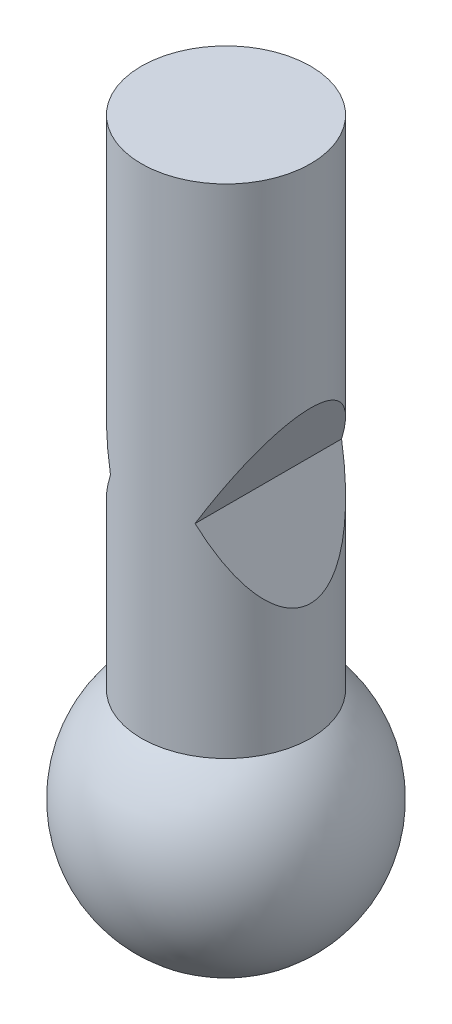
ISO-10303-21;
HEADER;
FILE_DESCRIPTION(('STEP AP214'),'2;1');
FILE_NAME('part.step','',(''),(''),'','','');
FILE_SCHEMA(('AUTOMOTIVE_DESIGN { 1 0 10303 214 1 1 1 1 }'));
ENDSEC;
DATA;
#1=APPLICATION_CONTEXT('core data for automotive mechanical design processes');
#2=APPLICATION_PROTOCOL_DEFINITION('international standard','automotive_design',2000,#1);
#3=PRODUCT_CONTEXT('',#1,'mechanical');
#4=PRODUCT('Part','Part','',(#3));
#5=PRODUCT_RELATED_PRODUCT_CATEGORY('part','',(#4));
#6=PRODUCT_DEFINITION_FORMATION('','',#4);
#7=PRODUCT_DEFINITION_CONTEXT('part definition',#1,'design');
#8=PRODUCT_DEFINITION('design','',#6,#7);
#9=PRODUCT_DEFINITION_SHAPE('','',#8);
#10=(LENGTH_UNIT() NAMED_UNIT(*) SI_UNIT(.MILLI.,.METRE.));
#11=(NAMED_UNIT(*) PLANE_ANGLE_UNIT() SI_UNIT($,.RADIAN.));
#12=(NAMED_UNIT(*) SI_UNIT($,.STERADIAN.) SOLID_ANGLE_UNIT());
#13=UNCERTAINTY_MEASURE_WITH_UNIT(LENGTH_MEASURE(1.E-05),#10,'distance_accuracy_value','');
#14=(GEOMETRIC_REPRESENTATION_CONTEXT(3) GLOBAL_UNCERTAINTY_ASSIGNED_CONTEXT((#13)) GLOBAL_UNIT_ASSIGNED_CONTEXT((#10,
#11,#12)) REPRESENTATION_CONTEXT('',''));
#15=CARTESIAN_POINT('',(0.,0.,0.));
#16=DIRECTION('',(0.,0.,1.));
#17=DIRECTION('',(1.,0.,0.));
#18=AXIS2_PLACEMENT_3D('',#15,#16,#17);
#19=CARTESIAN_POINT('',(0.,70.,0.));
#20=DIRECTION('',(0.,-1.,0.));
#21=DIRECTION('',(0.,0.,-1.));
#22=AXIS2_PLACEMENT_3D('',#19,#20,#21);
#23=CYLINDRICAL_SURFACE('',#22,10.);
#24=CARTESIAN_POINT('',(0.,44.9999999999996,0.));
#25=DIRECTION('',(-0.894427190999912,-0.447213595499966,0.));
#26=DIRECTION('',(0.447213595499966,-0.894427190999912,0.));
#27=AXIS2_PLACEMENT_3D('',#24,#25,#26);
#28=ELLIPSE('',#27,22.3606797749975,10.);
#29=CARTESIAN_POINT('',(4.99999999999989,35.,-8.66025403784445));
#30=VERTEX_POINT('',#29);
#31=CARTESIAN_POINT('',(4.99999999999989,35.,8.66025403784445));
#32=VERTEX_POINT('',#31);
#33=EDGE_CURVE('E11',#30,#32,#28,.T.);
#34=ORIENTED_EDGE('',*,*,#33,.T.);
#35=CARTESIAN_POINT('',(0.,25.0000000000004,0.));
#36=DIRECTION('',(-0.894427190999912,0.447213595499966,0.));
#37=DIRECTION('',(-0.447213595499966,-0.894427190999912,0.));
#38=AXIS2_PLACEMENT_3D('',#35,#36,#37);
#39=ELLIPSE('',#38,22.3606797749975,10.);
#40=EDGE_CURVE('E54',#32,#30,#39,.T.);
#41=ORIENTED_EDGE('',*,*,#40,.T.);
#42=EDGE_LOOP('',(#34,#41));
#43=FACE_BOUND('',#42,.T.);
#44=CARTESIAN_POINT('',(0.,45.0000000000002,0.));
#45=DIRECTION('',(0.894427190999914,-0.447213595499961,0.));
#46=DIRECTION('',(-0.447213595499961,-0.894427190999914,0.));
#47=AXIS2_PLACEMENT_3D('',#44,#45,#46);
#48=ELLIPSE('',#47,22.3606797749977,10.);
#49=CARTESIAN_POINT('',(-5.00000000000013,35.,8.66025403784431));
#50=VERTEX_POINT('',#49);
#51=CARTESIAN_POINT('',(-5.00000000000013,35.,-8.66025403784431));
#52=VERTEX_POINT('',#51);
#53=EDGE_CURVE('E80',#50,#52,#48,.T.);
#54=ORIENTED_EDGE('',*,*,#53,.T.);
#55=CARTESIAN_POINT('',(0.,25.0000000000001,0.));
#56=DIRECTION('',(0.894427190999909,0.447213595499971,0.));
#57=DIRECTION('',(0.447213595499971,-0.894427190999909,0.));
#58=AXIS2_PLACEMENT_3D('',#55,#56,#57);
#59=ELLIPSE('',#58,22.3606797749972,10.);
#60=EDGE_CURVE('E73',#52,#50,#59,.T.);
#61=ORIENTED_EDGE('',*,*,#60,.T.);
#62=EDGE_LOOP('',(#54,#61));
#63=FACE_BOUND('',#62,.T.);
#64=CARTESIAN_POINT('',(0.,11.1803398874989,0.));
#65=DIRECTION('',(0.,-1.,0.));
#66=DIRECTION('',(0.,0.,-1.));
#67=AXIS2_PLACEMENT_3D('',#64,#65,#66);
#68=CIRCLE('',#67,10.);
#69=CARTESIAN_POINT('',(0.,11.1803398874989,-10.));
#70=VERTEX_POINT('',#69);
#71=EDGE_CURVE('E85',#70,#70,#68,.T.);
#72=ORIENTED_EDGE('',*,*,#71,.F.);
#73=EDGE_LOOP('',(#72));
#74=FACE_BOUND('',#73,.T.);
#75=CARTESIAN_POINT('',(0.,70.,0.));
#76=DIRECTION('',(0.,1.,0.));
#77=DIRECTION('',(0.,0.,1.));
#78=AXIS2_PLACEMENT_3D('',#75,#76,#77);
#79=CIRCLE('',#78,10.);
#80=CARTESIAN_POINT('',(0.,70.,10.));
#81=VERTEX_POINT('',#80);
#82=EDGE_CURVE('E91',#81,#81,#79,.T.);
#83=ORIENTED_EDGE('',*,*,#82,.F.);
#84=EDGE_LOOP('',(#83));
#85=FACE_BOUND('',#84,.T.);
#86=ADVANCED_FACE('F45',(#43,#63,#74,#85),#23,.T.);
#87=CARTESIAN_POINT('',(0.,70.,0.));
#88=DIRECTION('',(0.,1.,0.));
#89=DIRECTION('',(0.,0.,1.));
#90=AXIS2_PLACEMENT_3D('',#87,#88,#89);
#91=PLANE('',#90);
#92=ORIENTED_EDGE('',*,*,#82,.T.);
#93=EDGE_LOOP('',(#92));
#94=FACE_BOUND('',#93,.T.);
#95=ADVANCED_FACE('F112',(#94),#91,.T.);
#96=CARTESIAN_POINT('',(0.,0.,0.));
#97=DIRECTION('',(0.,-1.,0.));
#98=DIRECTION('',(-1.,0.,0.));
#99=AXIS2_PLACEMENT_3D('',#96,#97,#98);
#100=SPHERICAL_SURFACE('',#99,15.);
#101=ORIENTED_EDGE('',*,*,#71,.T.);
#102=EDGE_LOOP('',(#101));
#103=FACE_BOUND('',#102,.T.);
#104=ADVANCED_FACE('F47',(#103),#100,.T.);
#105=CARTESIAN_POINT('',(-10.0000000000003,45.,-15.));
#106=DIRECTION('',(0.894427190999909,0.447213595499971,0.));
#107=DIRECTION('',(-0.447213595499971,0.894427190999909,0.));
#108=AXIS2_PLACEMENT_3D('',#105,#106,#107);
#109=PLANE('',#108);
#110=DIRECTION('',(0.,0.,1.));
#111=VECTOR('',#110,1.);
#112=CARTESIAN_POINT('',(-5.00000000000013,35.,-15.));
#113=LINE('',#112,#111);
#114=EDGE_CURVE('E77',#52,#50,#113,.T.);
#115=ORIENTED_EDGE('',*,*,#114,.T.);
#116=ORIENTED_EDGE('',*,*,#60,.F.);
#117=EDGE_LOOP('',(#115,#116));
#118=FACE_BOUND('',#117,.T.);
#119=ADVANCED_FACE('F75',(#118),#109,.F.);
#120=CARTESIAN_POINT('',(-5.00000000000013,35.,-15.));
#121=DIRECTION('',(0.894427190999914,-0.447213595499961,0.));
#122=DIRECTION('',(0.447213595499961,0.894427190999914,0.));
#123=AXIS2_PLACEMENT_3D('',#120,#121,#122);
#124=PLANE('',#123);
#125=ORIENTED_EDGE('',*,*,#53,.F.);
#126=ORIENTED_EDGE('',*,*,#114,.F.);
#127=EDGE_LOOP('',(#125,#126));
#128=FACE_BOUND('',#127,.T.);
#129=ADVANCED_FACE('F87',(#128),#124,.F.);
#130=CARTESIAN_POINT('',(4.99999999999989,35.,-15.));
#131=DIRECTION('',(-0.894427190999912,-0.447213595499966,0.));
#132=DIRECTION('',(0.447213595499966,-0.894427190999912,0.));
#133=AXIS2_PLACEMENT_3D('',#130,#131,#132);
#134=PLANE('',#133);
#135=ORIENTED_EDGE('',*,*,#33,.F.);
#136=DIRECTION('',(0.,0.,1.));
#137=VECTOR('',#136,1.);
#138=CARTESIAN_POINT('',(4.99999999999989,35.,-15.));
#139=LINE('',#138,#137);
#140=EDGE_CURVE('E60',#30,#32,#139,.T.);
#141=ORIENTED_EDGE('',*,*,#140,.T.);
#142=EDGE_LOOP('',(#135,#141));
#143=FACE_BOUND('',#142,.T.);
#144=ADVANCED_FACE('F102',(#143),#134,.F.);
#145=CARTESIAN_POINT('',(10.,45.,-15.));
#146=DIRECTION('',(-0.894427190999912,0.447213595499966,0.));
#147=DIRECTION('',(-0.447213595499966,-0.894427190999912,0.));
#148=AXIS2_PLACEMENT_3D('',#145,#146,#147);
#149=PLANE('',#148);
#150=ORIENTED_EDGE('',*,*,#140,.F.);
#151=ORIENTED_EDGE('',*,*,#40,.F.);
#152=EDGE_LOOP('',(#150,#151));
#153=FACE_BOUND('',#152,.T.);
#154=ADVANCED_FACE('F100',(#153),#149,.F.);
#155=CLOSED_SHELL('',(#86,#95,#104,#119,#129,#144,#154));
#156=MANIFOLD_SOLID_BREP('B2',#155);
#157=ADVANCED_BREP_SHAPE_REPRESENTATION('',(#18,#156),#14);
#158=SHAPE_DEFINITION_REPRESENTATION(#9,#157);
ENDSEC;
END-ISO-10303-21;
